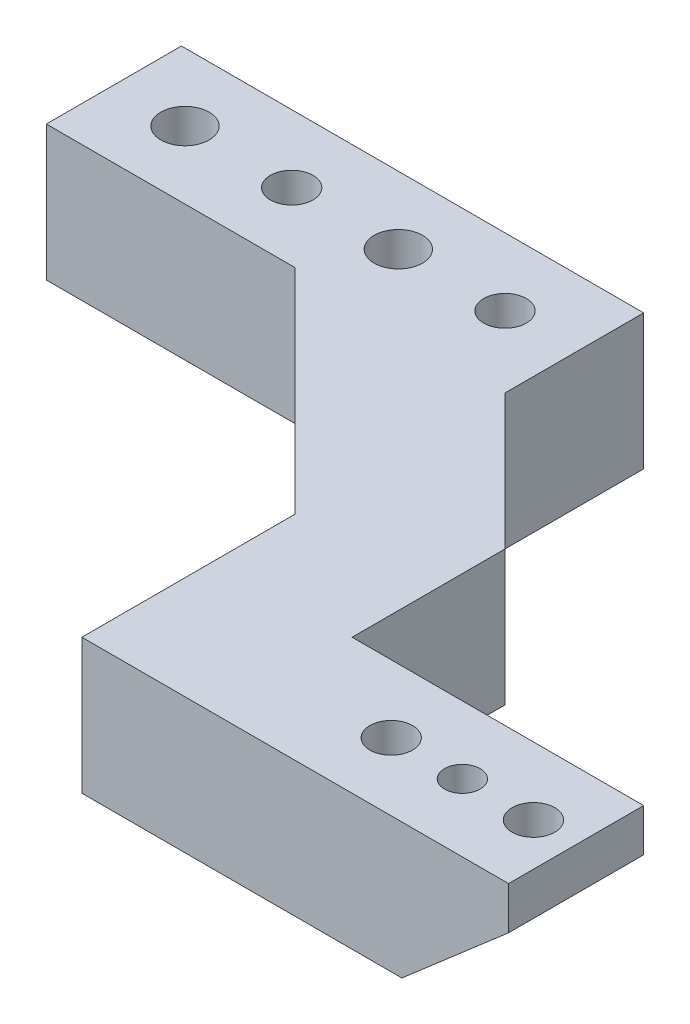
ISO-10303-21;
HEADER;
FILE_DESCRIPTION(('STEP AP214'),'2;1');
FILE_NAME('part.step','',(''),(''),'','','');
FILE_SCHEMA(('AUTOMOTIVE_DESIGN { 1 0 10303 214 1 1 1 1 }'));
ENDSEC;
DATA;
#1=APPLICATION_CONTEXT('core data for automotive mechanical design processes');
#2=APPLICATION_PROTOCOL_DEFINITION('international standard','automotive_design',2000,#1);
#3=PRODUCT_CONTEXT('',#1,'mechanical');
#4=PRODUCT('Part','Part','',(#3));
#5=PRODUCT_RELATED_PRODUCT_CATEGORY('part','',(#4));
#6=PRODUCT_DEFINITION_FORMATION('','',#4);
#7=PRODUCT_DEFINITION_CONTEXT('part definition',#1,'design');
#8=PRODUCT_DEFINITION('design','',#6,#7);
#9=PRODUCT_DEFINITION_SHAPE('','',#8);
#10=(LENGTH_UNIT() NAMED_UNIT(*) SI_UNIT(.MILLI.,.METRE.));
#11=(NAMED_UNIT(*) PLANE_ANGLE_UNIT() SI_UNIT($,.RADIAN.));
#12=(NAMED_UNIT(*) SI_UNIT($,.STERADIAN.) SOLID_ANGLE_UNIT());
#13=UNCERTAINTY_MEASURE_WITH_UNIT(LENGTH_MEASURE(1.E-05),#10,'distance_accuracy_value','');
#14=(GEOMETRIC_REPRESENTATION_CONTEXT(3) GLOBAL_UNCERTAINTY_ASSIGNED_CONTEXT((#13)) GLOBAL_UNIT_ASSIGNED_CONTEXT((#10,
#11,#12)) REPRESENTATION_CONTEXT('',''));
#15=CARTESIAN_POINT('',(0.,0.,0.));
#16=DIRECTION('',(0.,0.,1.));
#17=DIRECTION('',(1.,0.,0.));
#18=AXIS2_PLACEMENT_3D('',#15,#16,#17);
#19=CARTESIAN_POINT('',(0.,0.,0.));
#20=DIRECTION('',(0.,1.,0.));
#21=DIRECTION('',(0.,0.,1.));
#22=AXIS2_PLACEMENT_3D('',#19,#20,#21);
#23=PLANE('',#22);
#24=CARTESIAN_POINT('',(7.49999999999999,0.,0.));
#25=DIRECTION('',(0.,1.,0.));
#26=DIRECTION('',(0.,0.,1.));
#27=AXIS2_PLACEMENT_3D('',#24,#25,#26);
#28=CIRCLE('',#27,3.39999999999999);
#29=CARTESIAN_POINT('',(7.49999999999999,0.,3.39999999999999));
#30=VERTEX_POINT('',#29);
#31=EDGE_CURVE('E241',#30,#30,#28,.T.);
#32=ORIENTED_EDGE('',*,*,#31,.T.);
#33=EDGE_LOOP('',(#32));
#34=FACE_BOUND('',#33,.T.);
#35=CARTESIAN_POINT('',(-22.5,0.,0.));
#36=DIRECTION('',(0.,1.,0.));
#37=DIRECTION('',(0.,0.,1.));
#38=AXIS2_PLACEMENT_3D('',#35,#36,#37);
#39=CIRCLE('',#38,3.39999999999999);
#40=CARTESIAN_POINT('',(-22.5,0.,3.39999999999999));
#41=VERTEX_POINT('',#40);
#42=EDGE_CURVE('E235',#41,#41,#39,.T.);
#43=ORIENTED_EDGE('',*,*,#42,.T.);
#44=EDGE_LOOP('',(#43));
#45=FACE_BOUND('',#44,.T.);
#46=CARTESIAN_POINT('',(22.5,0.,0.));
#47=DIRECTION('',(0.,-1.,0.));
#48=DIRECTION('',(0.,0.,-1.));
#49=AXIS2_PLACEMENT_3D('',#46,#47,#48);
#50=CIRCLE('',#49,2.99999999999999);
#51=CARTESIAN_POINT('',(22.5,0.,-2.99999999999999));
#52=VERTEX_POINT('',#51);
#53=EDGE_CURVE('E226',#52,#52,#50,.T.);
#54=ORIENTED_EDGE('',*,*,#53,.F.);
#55=EDGE_LOOP('',(#54));
#56=FACE_BOUND('',#55,.T.);
#57=CARTESIAN_POINT('',(-7.50000000000001,0.,0.));
#58=DIRECTION('',(0.,-1.,0.));
#59=DIRECTION('',(0.,0.,-1.));
#60=AXIS2_PLACEMENT_3D('',#57,#58,#59);
#61=CIRCLE('',#60,2.99999999999999);
#62=CARTESIAN_POINT('',(-7.50000000000001,0.,-2.99999999999999));
#63=VERTEX_POINT('',#62);
#64=EDGE_CURVE('E220',#63,#63,#61,.T.);
#65=ORIENTED_EDGE('',*,*,#64,.F.);
#66=EDGE_LOOP('',(#65));
#67=FACE_BOUND('',#66,.T.);
#68=CARTESIAN_POINT('',(66.5,0.,60.));
#69=DIRECTION('',(0.,1.,0.));
#70=DIRECTION('',(0.,0.,1.));
#71=AXIS2_PLACEMENT_3D('',#68,#69,#70);
#72=CIRCLE('',#71,3.);
#73=CARTESIAN_POINT('',(66.5,0.,63.));
#74=VERTEX_POINT('',#73);
#75=EDGE_CURVE('E201',#74,#74,#72,.T.);
#76=ORIENTED_EDGE('',*,*,#75,.T.);
#77=EDGE_LOOP('',(#76));
#78=FACE_BOUND('',#77,.T.);
#79=DIRECTION('',(0.,0.,-1.));
#80=VECTOR('',#79,1.);
#81=CARTESIAN_POINT('',(77.5,0.,330.859028490707));
#82=LINE('',#81,#80);
#83=CARTESIAN_POINT('',(77.5,0.,69.5));
#84=VERTEX_POINT('',#83);
#85=CARTESIAN_POINT('',(77.5,0.,62.2912878474779));
#86=VERTEX_POINT('',#85);
#87=EDGE_CURVE('E53',#84,#86,#82,.T.);
#88=ORIENTED_EDGE('',*,*,#87,.F.);
#89=DIRECTION('',(-1.,0.,0.));
#90=VECTOR('',#89,1.);
#91=CARTESIAN_POINT('',(92.5,0.,69.5));
#92=LINE('',#91,#90);
#93=CARTESIAN_POINT('',(32.5,0.,69.5));
#94=VERTEX_POINT('',#93);
#95=EDGE_CURVE('E219',#84,#94,#92,.T.);
#96=ORIENTED_EDGE('',*,*,#95,.T.);
#97=DIRECTION('',(0.,0.,-1.));
#98=VECTOR('',#97,1.);
#99=CARTESIAN_POINT('',(32.5,0.,69.5));
#100=LINE('',#99,#98);
#101=CARTESIAN_POINT('',(32.5,0.,39.5000000000002));
#102=VERTEX_POINT('',#101);
#103=EDGE_CURVE('E210',#94,#102,#100,.T.);
#104=ORIENTED_EDGE('',*,*,#103,.T.);
#105=DIRECTION('',(0.707106781186544,0.,0.707106781186551));
#106=VECTOR('',#105,1.);
#107=CARTESIAN_POINT('',(-3.49999999999993,0.,3.49999999999989));
#108=LINE('',#107,#106);
#109=CARTESIAN_POINT('',(2.50000000000012,0.,9.49999999999999));
#110=VERTEX_POINT('',#109);
#111=EDGE_CURVE('E278',#102,#110,#108,.F.);
#112=ORIENTED_EDGE('',*,*,#111,.T.);
#113=DIRECTION('',(1.,0.,0.));
#114=VECTOR('',#113,1.);
#115=CARTESIAN_POINT('',(32.5,0.,9.49999999999999));
#116=LINE('',#115,#114);
#117=CARTESIAN_POINT('',(-32.5,0.,9.5));
#118=VERTEX_POINT('',#117);
#119=EDGE_CURVE('E255',#118,#110,#116,.T.);
#120=ORIENTED_EDGE('',*,*,#119,.F.);
#121=DIRECTION('',(0.,0.,1.));
#122=VECTOR('',#121,1.);
#123=CARTESIAN_POINT('',(-32.5,0.,9.5));
#124=LINE('',#123,#122);
#125=CARTESIAN_POINT('',(-32.5,0.,-9.5));
#126=VERTEX_POINT('',#125);
#127=EDGE_CURVE('E244',#126,#118,#124,.T.);
#128=ORIENTED_EDGE('',*,*,#127,.F.);
#129=DIRECTION('',(-1.,0.,0.));
#130=VECTOR('',#129,1.);
#131=CARTESIAN_POINT('',(32.5,0.,-9.50000000000001));
#132=LINE('',#131,#130);
#133=CARTESIAN_POINT('',(32.5,0.,-9.50000000000001));
#134=VERTEX_POINT('',#133);
#135=EDGE_CURVE('E249',#134,#126,#132,.T.);
#136=ORIENTED_EDGE('',*,*,#135,.F.);
#137=DIRECTION('',(0.,0.,-1.));
#138=VECTOR('',#137,1.);
#139=CARTESIAN_POINT('',(32.5,0.,-28.6917043740573));
#140=LINE('',#139,#138);
#141=CARTESIAN_POINT('',(32.5,0.,10.0242835595776));
#142=VERTEX_POINT('',#141);
#143=EDGE_CURVE('E178',#142,#134,#140,.T.);
#144=ORIENTED_EDGE('',*,*,#143,.F.);
#145=DIRECTION('',(-0.707106781186547,0.,-0.707106781186548));
#146=VECTOR('',#145,1.);
#147=CARTESIAN_POINT('',(32.5,0.,10.0242835595776));
#148=LINE('',#147,#146);
#149=CARTESIAN_POINT('',(51.5,0.,29.0242835595777));
#150=VERTEX_POINT('',#149);
#151=EDGE_CURVE('E175',#150,#142,#148,.T.);
#152=ORIENTED_EDGE('',*,*,#151,.F.);
#153=DIRECTION('',(0.,0.,-1.));
#154=VECTOR('',#153,1.);
#155=CARTESIAN_POINT('',(51.5,0.,29.0242835595777));
#156=LINE('',#155,#154);
#157=CARTESIAN_POINT('',(51.5,0.,50.5));
#158=VERTEX_POINT('',#157);
#159=EDGE_CURVE('E160',#158,#150,#156,.T.);
#160=ORIENTED_EDGE('',*,*,#159,.F.);
#161=DIRECTION('',(-1.,0.,0.));
#162=VECTOR('',#161,1.);
#163=CARTESIAN_POINT('',(51.5,0.,50.5));
#164=LINE('',#163,#162);
#165=CARTESIAN_POINT('',(77.5,0.,50.5));
#166=VERTEX_POINT('',#165);
#167=EDGE_CURVE('E165',#166,#158,#164,.T.);
#168=ORIENTED_EDGE('',*,*,#167,.F.);
#169=CARTESIAN_POINT('',(77.5,0.,57.7087121525221));
#170=VERTEX_POINT('',#169);
#171=EDGE_CURVE('E149',#170,#166,#82,.T.);
#172=ORIENTED_EDGE('',*,*,#171,.F.);
#173=CARTESIAN_POINT('',(76.5,0.,60.));
#174=DIRECTION('',(0.,1.,0.));
#175=DIRECTION('',(0.,0.,1.));
#176=AXIS2_PLACEMENT_3D('',#173,#174,#175);
#177=CIRCLE('',#176,2.5);
#178=EDGE_CURVE('E193',#170,#86,#177,.T.);
#179=ORIENTED_EDGE('',*,*,#178,.T.);
#180=EDGE_LOOP('',(#88,#96,#104,#112,#120,#128,#136,#144,#152,#160,#168,#172,#179));
#181=FACE_BOUND('',#180,.T.);
#182=ADVANCED_FACE('F37',(#34,#45,#56,#67,#78,#181),#23,.F.);
#183=CARTESIAN_POINT('',(92.5,19.,69.5));
#184=DIRECTION('',(0.,0.,-1.));
#185=DIRECTION('',(-1.,0.,0.));
#186=AXIS2_PLACEMENT_3D('',#183,#184,#185);
#187=PLANE('',#186);
#188=DIRECTION('',(-0.755689082789818,-0.654930538417842,0.));
#189=VECTOR('',#188,1.);
#190=CARTESIAN_POINT('',(95.4695431472081,15.5736040609137,69.5));
#191=LINE('',#190,#189);
#192=CARTESIAN_POINT('',(92.5,13.,69.5));
#193=VERTEX_POINT('',#192);
#194=EDGE_CURVE('E60',#193,#84,#191,.T.);
#195=ORIENTED_EDGE('',*,*,#194,.F.);
#196=DIRECTION('',(0.,-1.,0.));
#197=VECTOR('',#196,1.);
#198=CARTESIAN_POINT('',(92.5,19.,69.5));
#199=LINE('',#198,#197);
#200=CARTESIAN_POINT('',(92.5,19.,69.5));
#201=VERTEX_POINT('',#200);
#202=EDGE_CURVE('E147',#201,#193,#199,.T.);
#203=ORIENTED_EDGE('',*,*,#202,.F.);
#204=DIRECTION('',(-1.,0.,0.));
#205=VECTOR('',#204,1.);
#206=CARTESIAN_POINT('',(92.5,19.,69.5));
#207=LINE('',#206,#205);
#208=CARTESIAN_POINT('',(32.5,19.,69.5));
#209=VERTEX_POINT('',#208);
#210=EDGE_CURVE('E206',#201,#209,#207,.T.);
#211=ORIENTED_EDGE('',*,*,#210,.T.);
#212=DIRECTION('',(0.,-1.,0.));
#213=VECTOR('',#212,1.);
#214=CARTESIAN_POINT('',(32.5,19.,69.5));
#215=LINE('',#214,#213);
#216=EDGE_CURVE('E207',#209,#94,#215,.T.);
#217=ORIENTED_EDGE('',*,*,#216,.T.);
#218=ORIENTED_EDGE('',*,*,#95,.F.);
#219=EDGE_LOOP('',(#195,#203,#211,#217,#218));
#220=FACE_BOUND('',#219,.T.);
#221=ADVANCED_FACE('F318',(#220),#187,.F.);
#222=CARTESIAN_POINT('',(92.5,0.,0.));
#223=DIRECTION('',(1.,0.,0.));
#224=DIRECTION('',(0.,0.,-1.));
#225=AXIS2_PLACEMENT_3D('',#222,#223,#224);
#226=PLANE('',#225);
#227=ORIENTED_EDGE('',*,*,#202,.T.);
#228=DIRECTION('',(0.,0.,-1.));
#229=VECTOR('',#228,1.);
#230=CARTESIAN_POINT('',(92.5,13.,330.859028490707));
#231=LINE('',#230,#229);
#232=CARTESIAN_POINT('',(92.5,13.,50.5));
#233=VERTEX_POINT('',#232);
#234=EDGE_CURVE('E145',#193,#233,#231,.T.);
#235=ORIENTED_EDGE('',*,*,#234,.T.);
#236=DIRECTION('',(0.,-1.,0.));
#237=VECTOR('',#236,1.);
#238=CARTESIAN_POINT('',(92.5,0.,50.5));
#239=LINE('',#238,#237);
#240=CARTESIAN_POINT('',(92.5,19.,50.5));
#241=VERTEX_POINT('',#240);
#242=EDGE_CURVE('E134',#241,#233,#239,.T.);
#243=ORIENTED_EDGE('',*,*,#242,.F.);
#244=DIRECTION('',(0.,0.,1.));
#245=VECTOR('',#244,1.);
#246=CARTESIAN_POINT('',(92.5,19.,69.5));
#247=LINE('',#246,#245);
#248=EDGE_CURVE('E203',#241,#201,#247,.T.);
#249=ORIENTED_EDGE('',*,*,#248,.T.);
#250=EDGE_LOOP('',(#227,#235,#243,#249));
#251=FACE_BOUND('',#250,.T.);
#252=ADVANCED_FACE('F146',(#251),#226,.T.);
#253=CARTESIAN_POINT('',(86.5,19.,60.));
#254=DIRECTION('',(0.,1.,0.));
#255=DIRECTION('',(0.,0.,1.));
#256=AXIS2_PLACEMENT_3D('',#253,#254,#255);
#257=CYLINDRICAL_SURFACE('',#256,2.99999999999999);
#258=CARTESIAN_POINT('',(86.5,19.,60.));
#259=DIRECTION('',(0.,1.,0.));
#260=DIRECTION('',(0.,0.,1.));
#261=AXIS2_PLACEMENT_3D('',#258,#259,#260);
#262=CIRCLE('',#261,2.99999999999999);
#263=CARTESIAN_POINT('',(86.5,19.,63.));
#264=VERTEX_POINT('',#263);
#265=EDGE_CURVE('E195',#264,#264,#262,.T.);
#266=ORIENTED_EDGE('',*,*,#265,.T.);
#267=EDGE_LOOP('',(#266));
#268=FACE_BOUND('',#267,.T.);
#269=CARTESIAN_POINT('',(86.5,7.79999999999999,60.));
#270=DIRECTION('',(0.654930538417842,-0.755689082789818,0.));
#271=DIRECTION('',(0.755689082789818,0.654930538417842,0.));
#272=AXIS2_PLACEMENT_3D('',#269,#270,#271);
#273=ELLIPSE('',#272,3.96988664825583,2.99999999999999);
#274=CARTESIAN_POINT('',(89.5,10.4,60.));
#275=VERTEX_POINT('',#274);
#276=EDGE_CURVE('E11',#275,#275,#273,.F.);
#277=ORIENTED_EDGE('',*,*,#276,.F.);
#278=EDGE_LOOP('',(#277));
#279=FACE_BOUND('',#278,.T.);
#280=ADVANCED_FACE('F325',(#268,#279),#257,.F.);
#281=CARTESIAN_POINT('',(76.5,19.,60.));
#282=DIRECTION('',(0.,1.,0.));
#283=DIRECTION('',(0.,0.,1.));
#284=AXIS2_PLACEMENT_3D('',#281,#282,#283);
#285=CYLINDRICAL_SURFACE('',#284,2.5);
#286=CARTESIAN_POINT('',(76.5,19.,60.));
#287=DIRECTION('',(0.,1.,0.));
#288=DIRECTION('',(0.,0.,1.));
#289=AXIS2_PLACEMENT_3D('',#286,#287,#288);
#290=CIRCLE('',#289,2.5);
#291=CARTESIAN_POINT('',(76.5,19.,62.5));
#292=VERTEX_POINT('',#291);
#293=EDGE_CURVE('E190',#292,#292,#290,.T.);
#294=ORIENTED_EDGE('',*,*,#293,.T.);
#295=EDGE_LOOP('',(#294));
#296=FACE_BOUND('',#295,.T.);
#297=CARTESIAN_POINT('',(76.5,-0.866666666666679,60.));
#298=DIRECTION('',(0.654930538417842,-0.755689082789818,0.));
#299=DIRECTION('',(0.755689082789818,0.654930538417842,0.));
#300=AXIS2_PLACEMENT_3D('',#297,#298,#299);
#301=ELLIPSE('',#300,3.30823887354654,2.5);
#302=EDGE_CURVE('E154',#86,#170,#301,.F.);
#303=ORIENTED_EDGE('',*,*,#302,.F.);
#304=ORIENTED_EDGE('',*,*,#178,.F.);
#305=EDGE_LOOP('',(#303,#304));
#306=FACE_BOUND('',#305,.T.);
#307=ADVANCED_FACE('F356',(#296,#306),#285,.F.);
#308=CARTESIAN_POINT('',(51.5,19.,50.5));
#309=DIRECTION('',(0.,0.,1.));
#310=DIRECTION('',(1.,0.,0.));
#311=AXIS2_PLACEMENT_3D('',#308,#309,#310);
#312=PLANE('',#311);
#313=DIRECTION('',(0.755689082789818,0.654930538417842,0.));
#314=VECTOR('',#313,1.);
#315=CARTESIAN_POINT('',(72.0558375634518,-4.71827411167513,50.5));
#316=LINE('',#315,#314);
#317=EDGE_CURVE('E41',#166,#233,#316,.T.);
#318=ORIENTED_EDGE('',*,*,#317,.F.);
#319=ORIENTED_EDGE('',*,*,#167,.T.);
#320=DIRECTION('',(0.,-1.,0.));
#321=VECTOR('',#320,1.);
#322=CARTESIAN_POINT('',(51.5,19.,50.5));
#323=LINE('',#322,#321);
#324=CARTESIAN_POINT('',(51.5,19.,50.5));
#325=VERTEX_POINT('',#324);
#326=EDGE_CURVE('E181',#325,#158,#323,.T.);
#327=ORIENTED_EDGE('',*,*,#326,.F.);
#328=DIRECTION('',(-1.,0.,0.));
#329=VECTOR('',#328,1.);
#330=CARTESIAN_POINT('',(51.5,19.,50.5));
#331=LINE('',#330,#329);
#332=EDGE_CURVE('E140',#241,#325,#331,.T.);
#333=ORIENTED_EDGE('',*,*,#332,.F.);
#334=ORIENTED_EDGE('',*,*,#242,.T.);
#335=EDGE_LOOP('',(#318,#319,#327,#333,#334));
#336=FACE_BOUND('',#335,.T.);
#337=ADVANCED_FACE('F136',(#336),#312,.F.);
#338=CARTESIAN_POINT('',(-32.5,19.,9.5));
#339=DIRECTION('',(1.,0.,0.));
#340=DIRECTION('',(0.,0.,-1.));
#341=AXIS2_PLACEMENT_3D('',#338,#339,#340);
#342=PLANE('',#341);
#343=ORIENTED_EDGE('',*,*,#127,.T.);
#344=DIRECTION('',(0.,-1.,0.));
#345=VECTOR('',#344,1.);
#346=CARTESIAN_POINT('',(-32.5,19.,9.5));
#347=LINE('',#346,#345);
#348=CARTESIAN_POINT('',(-32.5,19.,9.5));
#349=VERTEX_POINT('',#348);
#350=EDGE_CURVE('E259',#349,#118,#347,.T.);
#351=ORIENTED_EDGE('',*,*,#350,.F.);
#352=DIRECTION('',(0.,0.,1.));
#353=VECTOR('',#352,1.);
#354=CARTESIAN_POINT('',(-32.5,19.,9.5));
#355=LINE('',#354,#353);
#356=CARTESIAN_POINT('',(-32.5,19.,-9.5));
#357=VERTEX_POINT('',#356);
#358=EDGE_CURVE('E245',#357,#349,#355,.T.);
#359=ORIENTED_EDGE('',*,*,#358,.F.);
#360=DIRECTION('',(0.,-1.,0.));
#361=VECTOR('',#360,1.);
#362=CARTESIAN_POINT('',(-32.5,19.,-9.5));
#363=LINE('',#362,#361);
#364=EDGE_CURVE('E252',#357,#126,#363,.T.);
#365=ORIENTED_EDGE('',*,*,#364,.T.);
#366=EDGE_LOOP('',(#343,#351,#359,#365));
#367=FACE_BOUND('',#366,.T.);
#368=ADVANCED_FACE('F300',(#367),#342,.F.);
#369=CARTESIAN_POINT('',(32.5,19.,9.49999999999999));
#370=DIRECTION('',(0.,0.,-1.));
#371=DIRECTION('',(-1.,0.,0.));
#372=AXIS2_PLACEMENT_3D('',#369,#370,#371);
#373=PLANE('',#372);
#374=ORIENTED_EDGE('',*,*,#119,.T.);
#375=DIRECTION('',(0.,1.,0.));
#376=VECTOR('',#375,1.);
#377=CARTESIAN_POINT('',(2.50000000000012,19.,9.49999999999999));
#378=LINE('',#377,#376);
#379=CARTESIAN_POINT('',(2.50000000000012,19.,9.49999999999999));
#380=VERTEX_POINT('',#379);
#381=EDGE_CURVE('E276',#110,#380,#378,.T.);
#382=ORIENTED_EDGE('',*,*,#381,.T.);
#383=DIRECTION('',(1.,0.,0.));
#384=VECTOR('',#383,1.);
#385=CARTESIAN_POINT('',(32.5,19.,9.49999999999999));
#386=LINE('',#385,#384);
#387=EDGE_CURVE('E248',#349,#380,#386,.T.);
#388=ORIENTED_EDGE('',*,*,#387,.F.);
#389=ORIENTED_EDGE('',*,*,#350,.T.);
#390=EDGE_LOOP('',(#374,#382,#388,#389));
#391=FACE_BOUND('',#390,.T.);
#392=ADVANCED_FACE('F296',(#391),#373,.F.);
#393=CARTESIAN_POINT('',(32.5,19.,-9.50000000000001));
#394=DIRECTION('',(0.,0.,1.));
#395=DIRECTION('',(1.,0.,0.));
#396=AXIS2_PLACEMENT_3D('',#393,#394,#395);
#397=PLANE('',#396);
#398=DIRECTION('',(-1.,0.,0.));
#399=VECTOR('',#398,1.);
#400=CARTESIAN_POINT('',(32.5,19.,-9.50000000000001));
#401=LINE('',#400,#399);
#402=CARTESIAN_POINT('',(32.5,19.,-9.50000000000001));
#403=VERTEX_POINT('',#402);
#404=EDGE_CURVE('E250',#403,#357,#401,.T.);
#405=ORIENTED_EDGE('',*,*,#404,.F.);
#406=DIRECTION('',(0.,-1.,0.));
#407=VECTOR('',#406,1.);
#408=CARTESIAN_POINT('',(32.5,19.,-9.50000000000001));
#409=LINE('',#408,#407);
#410=EDGE_CURVE('E184',#403,#134,#409,.T.);
#411=ORIENTED_EDGE('',*,*,#410,.T.);
#412=ORIENTED_EDGE('',*,*,#135,.T.);
#413=ORIENTED_EDGE('',*,*,#364,.F.);
#414=EDGE_LOOP('',(#405,#411,#412,#413));
#415=FACE_BOUND('',#414,.T.);
#416=ADVANCED_FACE('F307',(#415),#397,.F.);
#417=CARTESIAN_POINT('',(0.,19.,0.));
#418=DIRECTION('',(0.,1.,0.));
#419=DIRECTION('',(0.,0.,1.));
#420=AXIS2_PLACEMENT_3D('',#417,#418,#419);
#421=PLANE('',#420);
#422=ORIENTED_EDGE('',*,*,#332,.T.);
#423=DIRECTION('',(0.,0.,-1.));
#424=VECTOR('',#423,1.);
#425=CARTESIAN_POINT('',(51.5,19.,29.0242835595777));
#426=LINE('',#425,#424);
#427=CARTESIAN_POINT('',(51.5,19.,29.0242835595777));
#428=VERTEX_POINT('',#427);
#429=EDGE_CURVE('E161',#325,#428,#426,.T.);
#430=ORIENTED_EDGE('',*,*,#429,.T.);
#431=DIRECTION('',(-0.707106781186547,0.,-0.707106781186548));
#432=VECTOR('',#431,1.);
#433=CARTESIAN_POINT('',(32.5,19.,10.0242835595776));
#434=LINE('',#433,#432);
#435=CARTESIAN_POINT('',(32.5,19.,10.0242835595776));
#436=VERTEX_POINT('',#435);
#437=EDGE_CURVE('E164',#428,#436,#434,.T.);
#438=ORIENTED_EDGE('',*,*,#437,.T.);
#439=DIRECTION('',(0.,0.,-1.));
#440=VECTOR('',#439,1.);
#441=CARTESIAN_POINT('',(32.5,19.,-28.6917043740573));
#442=LINE('',#441,#440);
#443=EDGE_CURVE('E168',#436,#403,#442,.T.);
#444=ORIENTED_EDGE('',*,*,#443,.T.);
#445=ORIENTED_EDGE('',*,*,#404,.T.);
#446=ORIENTED_EDGE('',*,*,#358,.T.);
#447=ORIENTED_EDGE('',*,*,#387,.T.);
#448=DIRECTION('',(-0.707106781186544,0.,-0.707106781186551));
#449=VECTOR('',#448,1.);
#450=CARTESIAN_POINT('',(32.5,19.,39.5000000000002));
#451=LINE('',#450,#449);
#452=CARTESIAN_POINT('',(32.5,19.,39.5000000000002));
#453=VERTEX_POINT('',#452);
#454=EDGE_CURVE('E143',#380,#453,#451,.F.);
#455=ORIENTED_EDGE('',*,*,#454,.T.);
#456=DIRECTION('',(0.,0.,1.));
#457=VECTOR('',#456,1.);
#458=CARTESIAN_POINT('',(32.5,19.,69.5));
#459=LINE('',#458,#457);
#460=EDGE_CURVE('E204',#453,#209,#459,.T.);
#461=ORIENTED_EDGE('',*,*,#460,.T.);
#462=ORIENTED_EDGE('',*,*,#210,.F.);
#463=ORIENTED_EDGE('',*,*,#248,.F.);
#464=EDGE_LOOP('',(#422,#430,#438,#444,#445,#446,#447,#455,#461,#462,#463));
#465=FACE_BOUND('',#464,.T.);
#466=ORIENTED_EDGE('',*,*,#293,.F.);
#467=EDGE_LOOP('',(#466));
#468=FACE_BOUND('',#467,.T.);
#469=ORIENTED_EDGE('',*,*,#265,.F.);
#470=EDGE_LOOP('',(#469));
#471=FACE_BOUND('',#470,.T.);
#472=CARTESIAN_POINT('',(66.5,19.,60.));
#473=DIRECTION('',(0.,1.,0.));
#474=DIRECTION('',(0.,0.,1.));
#475=AXIS2_PLACEMENT_3D('',#472,#473,#474);
#476=CIRCLE('',#475,2.99999999999999);
#477=CARTESIAN_POINT('',(66.5,19.,63.));
#478=VERTEX_POINT('',#477);
#479=EDGE_CURVE('E198',#478,#478,#476,.T.);
#480=ORIENTED_EDGE('',*,*,#479,.F.);
#481=EDGE_LOOP('',(#480));
#482=FACE_BOUND('',#481,.T.);
#483=CARTESIAN_POINT('',(-7.50000000000001,19.,0.));
#484=DIRECTION('',(0.,1.,0.));
#485=DIRECTION('',(0.,0.,1.));
#486=AXIS2_PLACEMENT_3D('',#483,#484,#485);
#487=CIRCLE('',#486,2.99999999999999);
#488=CARTESIAN_POINT('',(-7.50000000000001,19.,2.99999999999999));
#489=VERTEX_POINT('',#488);
#490=EDGE_CURVE('E223',#489,#489,#487,.T.);
#491=ORIENTED_EDGE('',*,*,#490,.F.);
#492=EDGE_LOOP('',(#491));
#493=FACE_BOUND('',#492,.T.);
#494=CARTESIAN_POINT('',(22.5,19.,0.));
#495=DIRECTION('',(0.,1.,0.));
#496=DIRECTION('',(0.,0.,1.));
#497=AXIS2_PLACEMENT_3D('',#494,#495,#496);
#498=CIRCLE('',#497,2.99999999999999);
#499=CARTESIAN_POINT('',(22.5,19.,2.99999999999999));
#500=VERTEX_POINT('',#499);
#501=EDGE_CURVE('E229',#500,#500,#498,.T.);
#502=ORIENTED_EDGE('',*,*,#501,.F.);
#503=EDGE_LOOP('',(#502));
#504=FACE_BOUND('',#503,.T.);
#505=CARTESIAN_POINT('',(-22.5,19.,0.));
#506=DIRECTION('',(0.,1.,0.));
#507=DIRECTION('',(0.,0.,1.));
#508=AXIS2_PLACEMENT_3D('',#505,#506,#507);
#509=CIRCLE('',#508,3.39999999999999);
#510=CARTESIAN_POINT('',(-22.5,19.,3.39999999999999));
#511=VERTEX_POINT('',#510);
#512=EDGE_CURVE('E232',#511,#511,#509,.T.);
#513=ORIENTED_EDGE('',*,*,#512,.F.);
#514=EDGE_LOOP('',(#513));
#515=FACE_BOUND('',#514,.T.);
#516=CARTESIAN_POINT('',(7.49999999999999,19.,0.));
#517=DIRECTION('',(0.,1.,0.));
#518=DIRECTION('',(0.,0.,1.));
#519=AXIS2_PLACEMENT_3D('',#516,#517,#518);
#520=CIRCLE('',#519,3.39999999999999);
#521=CARTESIAN_POINT('',(7.49999999999999,19.,3.39999999999999));
#522=VERTEX_POINT('',#521);
#523=EDGE_CURVE('E238',#522,#522,#520,.T.);
#524=ORIENTED_EDGE('',*,*,#523,.F.);
#525=EDGE_LOOP('',(#524));
#526=FACE_BOUND('',#525,.T.);
#527=ADVANCED_FACE('F283',(#465,#468,#471,#482,#493,#504,#515,#526),#421,.T.);
#528=CARTESIAN_POINT('',(7.49999999999999,19.,0.));
#529=DIRECTION('',(0.,1.,0.));
#530=DIRECTION('',(0.,0.,1.));
#531=AXIS2_PLACEMENT_3D('',#528,#529,#530);
#532=CYLINDRICAL_SURFACE('',#531,3.39999999999999);
#533=ORIENTED_EDGE('',*,*,#31,.F.);
#534=EDGE_LOOP('',(#533));
#535=FACE_BOUND('',#534,.T.);
#536=ORIENTED_EDGE('',*,*,#523,.T.);
#537=EDGE_LOOP('',(#536));
#538=FACE_BOUND('',#537,.T.);
#539=ADVANCED_FACE('F342',(#535,#538),#532,.F.);
#540=CARTESIAN_POINT('',(-22.5,19.,0.));
#541=DIRECTION('',(0.,1.,0.));
#542=DIRECTION('',(0.,0.,1.));
#543=AXIS2_PLACEMENT_3D('',#540,#541,#542);
#544=CYLINDRICAL_SURFACE('',#543,3.39999999999999);
#545=ORIENTED_EDGE('',*,*,#42,.F.);
#546=EDGE_LOOP('',(#545));
#547=FACE_BOUND('',#546,.T.);
#548=ORIENTED_EDGE('',*,*,#512,.T.);
#549=EDGE_LOOP('',(#548));
#550=FACE_BOUND('',#549,.T.);
#551=ADVANCED_FACE('F338',(#547,#550),#544,.F.);
#552=CARTESIAN_POINT('',(22.5,0.,0.));
#553=DIRECTION('',(0.,-1.,0.));
#554=DIRECTION('',(0.,0.,-1.));
#555=AXIS2_PLACEMENT_3D('',#552,#553,#554);
#556=CYLINDRICAL_SURFACE('',#555,2.99999999999999);
#557=ORIENTED_EDGE('',*,*,#501,.T.);
#558=EDGE_LOOP('',(#557));
#559=FACE_BOUND('',#558,.T.);
#560=ORIENTED_EDGE('',*,*,#53,.T.);
#561=EDGE_LOOP('',(#560));
#562=FACE_BOUND('',#561,.T.);
#563=ADVANCED_FACE('F334',(#559,#562),#556,.F.);
#564=CARTESIAN_POINT('',(-7.50000000000001,0.,0.));
#565=DIRECTION('',(0.,-1.,0.));
#566=DIRECTION('',(0.,0.,-1.));
#567=AXIS2_PLACEMENT_3D('',#564,#565,#566);
#568=CYLINDRICAL_SURFACE('',#567,2.99999999999999);
#569=ORIENTED_EDGE('',*,*,#490,.T.);
#570=EDGE_LOOP('',(#569));
#571=FACE_BOUND('',#570,.T.);
#572=ORIENTED_EDGE('',*,*,#64,.T.);
#573=EDGE_LOOP('',(#572));
#574=FACE_BOUND('',#573,.T.);
#575=ADVANCED_FACE('F331',(#571,#574),#568,.F.);
#576=CARTESIAN_POINT('',(32.5,0.,0.));
#577=DIRECTION('',(1.,0.,0.));
#578=DIRECTION('',(0.,0.,-1.));
#579=AXIS2_PLACEMENT_3D('',#576,#577,#578);
#580=PLANE('',#579);
#581=ORIENTED_EDGE('',*,*,#460,.F.);
#582=DIRECTION('',(0.,-1.,0.));
#583=VECTOR('',#582,1.);
#584=CARTESIAN_POINT('',(32.5,0.,39.5000000000002));
#585=LINE('',#584,#583);
#586=EDGE_CURVE('E262',#453,#102,#585,.T.);
#587=ORIENTED_EDGE('',*,*,#586,.T.);
#588=ORIENTED_EDGE('',*,*,#103,.F.);
#589=ORIENTED_EDGE('',*,*,#216,.F.);
#590=EDGE_LOOP('',(#581,#587,#588,#589));
#591=FACE_BOUND('',#590,.T.);
#592=ADVANCED_FACE('F292',(#591),#580,.F.);
#593=CARTESIAN_POINT('',(66.5,19.,60.));
#594=DIRECTION('',(0.,1.,0.));
#595=DIRECTION('',(0.,0.,1.));
#596=AXIS2_PLACEMENT_3D('',#593,#594,#595);
#597=CYLINDRICAL_SURFACE('',#596,3.);
#598=ORIENTED_EDGE('',*,*,#479,.T.);
#599=EDGE_LOOP('',(#598));
#600=FACE_BOUND('',#599,.T.);
#601=ORIENTED_EDGE('',*,*,#75,.F.);
#602=EDGE_LOOP('',(#601));
#603=FACE_BOUND('',#602,.T.);
#604=ADVANCED_FACE('F374',(#600,#603),#597,.F.);
#605=CARTESIAN_POINT('',(32.5,0.,39.5000000000002));
#606=DIRECTION('',(-0.707106781186551,0.,0.707106781186544));
#607=DIRECTION('',(0.,1.,0.));
#608=AXIS2_PLACEMENT_3D('',#605,#606,#607);
#609=PLANE('',#608);
#610=ORIENTED_EDGE('',*,*,#454,.F.);
#611=ORIENTED_EDGE('',*,*,#381,.F.);
#612=ORIENTED_EDGE('',*,*,#111,.F.);
#613=ORIENTED_EDGE('',*,*,#586,.F.);
#614=EDGE_LOOP('',(#610,#611,#612,#613));
#615=FACE_BOUND('',#614,.T.);
#616=ADVANCED_FACE('F39',(#615),#609,.T.);
#617=CARTESIAN_POINT('',(32.5,19.,-28.6917043740573));
#618=DIRECTION('',(-1.,0.,0.));
#619=DIRECTION('',(0.,0.,1.));
#620=AXIS2_PLACEMENT_3D('',#617,#618,#619);
#621=PLANE('',#620);
#622=ORIENTED_EDGE('',*,*,#443,.F.);
#623=DIRECTION('',(0.,-1.,0.));
#624=VECTOR('',#623,1.);
#625=CARTESIAN_POINT('',(32.5,19.,10.0242835595776));
#626=LINE('',#625,#624);
#627=EDGE_CURVE('E185',#436,#142,#626,.T.);
#628=ORIENTED_EDGE('',*,*,#627,.T.);
#629=ORIENTED_EDGE('',*,*,#143,.T.);
#630=ORIENTED_EDGE('',*,*,#410,.F.);
#631=EDGE_LOOP('',(#622,#628,#629,#630));
#632=FACE_BOUND('',#631,.T.);
#633=ADVANCED_FACE('F310',(#632),#621,.F.);
#634=CARTESIAN_POINT('',(51.5,19.,29.0242835595777));
#635=DIRECTION('',(-1.,0.,0.));
#636=DIRECTION('',(0.,0.,1.));
#637=AXIS2_PLACEMENT_3D('',#634,#635,#636);
#638=PLANE('',#637);
#639=ORIENTED_EDGE('',*,*,#159,.T.);
#640=DIRECTION('',(0.,-1.,0.));
#641=VECTOR('',#640,1.);
#642=CARTESIAN_POINT('',(51.5,19.,29.0242835595777));
#643=LINE('',#642,#641);
#644=EDGE_CURVE('E172',#428,#150,#643,.T.);
#645=ORIENTED_EDGE('',*,*,#644,.F.);
#646=ORIENTED_EDGE('',*,*,#429,.F.);
#647=ORIENTED_EDGE('',*,*,#326,.T.);
#648=EDGE_LOOP('',(#639,#645,#646,#647));
#649=FACE_BOUND('',#648,.T.);
#650=ADVANCED_FACE('F317',(#649),#638,.F.);
#651=CARTESIAN_POINT('',(32.5,19.,10.0242835595776));
#652=DIRECTION('',(-0.707106781186548,0.,0.707106781186547));
#653=DIRECTION('',(0.707106781186547,0.,0.707106781186548));
#654=AXIS2_PLACEMENT_3D('',#651,#652,#653);
#655=PLANE('',#654);
#656=ORIENTED_EDGE('',*,*,#151,.T.);
#657=ORIENTED_EDGE('',*,*,#627,.F.);
#658=ORIENTED_EDGE('',*,*,#437,.F.);
#659=ORIENTED_EDGE('',*,*,#644,.T.);
#660=EDGE_LOOP('',(#656,#657,#658,#659));
#661=FACE_BOUND('',#660,.T.);
#662=ADVANCED_FACE('F314',(#661),#655,.F.);
#663=CARTESIAN_POINT('',(92.5,13.,330.859028490707));
#664=DIRECTION('',(0.654930538417842,-0.755689082789818,0.));
#665=DIRECTION('',(0.755689082789818,0.654930538417842,0.));
#666=AXIS2_PLACEMENT_3D('',#663,#664,#665);
#667=PLANE('',#666);
#668=ORIENTED_EDGE('',*,*,#276,.T.);
#669=EDGE_LOOP('',(#668));
#670=FACE_BOUND('',#669,.T.);
#671=ORIENTED_EDGE('',*,*,#234,.F.);
#672=ORIENTED_EDGE('',*,*,#194,.T.);
#673=ORIENTED_EDGE('',*,*,#87,.T.);
#674=ORIENTED_EDGE('',*,*,#302,.T.);
#675=ORIENTED_EDGE('',*,*,#171,.T.);
#676=ORIENTED_EDGE('',*,*,#317,.T.);
#677=EDGE_LOOP('',(#671,#672,#673,#674,#675,#676));
#678=FACE_BOUND('',#677,.T.);
#679=ADVANCED_FACE('F152',(#670,#678),#667,.T.);
#680=CLOSED_SHELL('',(#182,#221,#252,#280,#307,#337,#368,#392,#416,#527,#539,#551,#563,#575,
#592,#604,#616,#633,#650,#662,#679));
#681=MANIFOLD_SOLID_BREP('B2',#680);
#682=ADVANCED_BREP_SHAPE_REPRESENTATION('',(#18,#681),#14);
#683=SHAPE_DEFINITION_REPRESENTATION(#9,#682);
ENDSEC;
END-ISO-10303-21;
